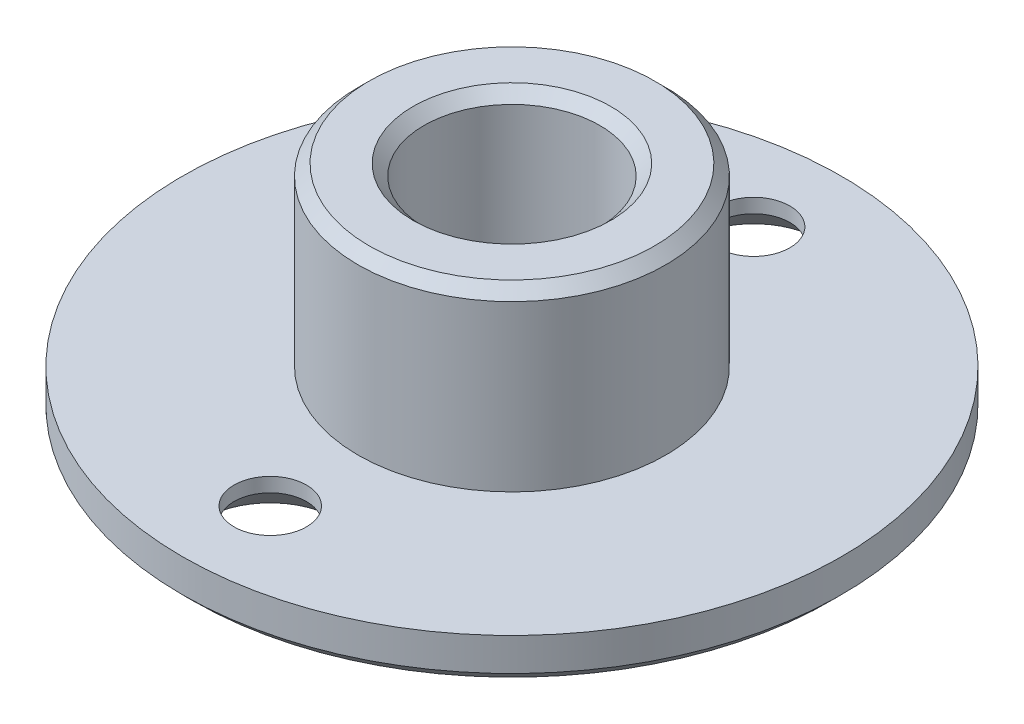
ISO-10303-21;
HEADER;
FILE_DESCRIPTION(('STEP AP214'),'2;1');
FILE_NAME('part.step','',(''),(''),'','','');
FILE_SCHEMA(('AUTOMOTIVE_DESIGN { 1 0 10303 214 1 1 1 1 }'));
ENDSEC;
DATA;
#1=APPLICATION_CONTEXT('core data for automotive mechanical design processes');
#2=APPLICATION_PROTOCOL_DEFINITION('international standard','automotive_design',2000,#1);
#3=PRODUCT_CONTEXT('',#1,'mechanical');
#4=PRODUCT('Part','Part','',(#3));
#5=PRODUCT_RELATED_PRODUCT_CATEGORY('part','',(#4));
#6=PRODUCT_DEFINITION_FORMATION('','',#4);
#7=PRODUCT_DEFINITION_CONTEXT('part definition',#1,'design');
#8=PRODUCT_DEFINITION('design','',#6,#7);
#9=PRODUCT_DEFINITION_SHAPE('','',#8);
#10=(LENGTH_UNIT() NAMED_UNIT(*) SI_UNIT(.MILLI.,.METRE.));
#11=(NAMED_UNIT(*) PLANE_ANGLE_UNIT() SI_UNIT($,.RADIAN.));
#12=(NAMED_UNIT(*) SI_UNIT($,.STERADIAN.) SOLID_ANGLE_UNIT());
#13=UNCERTAINTY_MEASURE_WITH_UNIT(LENGTH_MEASURE(1.E-05),#10,'distance_accuracy_value','');
#14=(GEOMETRIC_REPRESENTATION_CONTEXT(3) GLOBAL_UNCERTAINTY_ASSIGNED_CONTEXT((#13)) GLOBAL_UNIT_ASSIGNED_CONTEXT((#10,
#11,#12)) REPRESENTATION_CONTEXT('',''));
#15=CARTESIAN_POINT('',(0.,0.,0.));
#16=DIRECTION('',(0.,0.,1.));
#17=DIRECTION('',(1.,0.,0.));
#18=AXIS2_PLACEMENT_3D('',#15,#16,#17);
#19=CARTESIAN_POINT('',(0.,2.,0.));
#20=DIRECTION('',(0.,-1.,0.));
#21=DIRECTION('',(0.,0.,-1.));
#22=AXIS2_PLACEMENT_3D('',#19,#20,#21);
#23=CYLINDRICAL_SURFACE('',#22,15.);
#24=CARTESIAN_POINT('',(0.,0.499999999999999,0.));
#25=DIRECTION('',(0.,1.,0.));
#26=DIRECTION('',(0.,0.,1.));
#27=AXIS2_PLACEMENT_3D('',#24,#25,#26);
#28=CIRCLE('',#27,15.);
#29=CARTESIAN_POINT('',(0.,0.499999999999999,15.));
#30=VERTEX_POINT('',#29);
#31=EDGE_CURVE('E60',#30,#30,#28,.T.);
#32=ORIENTED_EDGE('',*,*,#31,.T.);
#33=EDGE_LOOP('',(#32));
#34=FACE_BOUND('',#33,.T.);
#35=CARTESIAN_POINT('',(0.,2.,0.));
#36=DIRECTION('',(0.,1.,0.));
#37=DIRECTION('',(0.,0.,1.));
#38=AXIS2_PLACEMENT_3D('',#35,#36,#37);
#39=CIRCLE('',#38,15.);
#40=CARTESIAN_POINT('',(0.,2.,15.));
#41=VERTEX_POINT('',#40);
#42=EDGE_CURVE('E85',#41,#41,#39,.T.);
#43=ORIENTED_EDGE('',*,*,#42,.F.);
#44=EDGE_LOOP('',(#43));
#45=FACE_BOUND('',#44,.T.);
#46=ADVANCED_FACE('F41',(#34,#45),#23,.T.);
#47=CARTESIAN_POINT('',(0.,2.,0.));
#48=DIRECTION('',(0.,1.,0.));
#49=DIRECTION('',(0.,0.,1.));
#50=AXIS2_PLACEMENT_3D('',#47,#48,#49);
#51=PLANE('',#50);
#52=CARTESIAN_POINT('',(0.,2.,11.));
#53=DIRECTION('',(0.,1.,0.));
#54=DIRECTION('',(0.,0.,1.));
#55=AXIS2_PLACEMENT_3D('',#52,#53,#54);
#56=CIRCLE('',#55,1.65);
#57=CARTESIAN_POINT('',(0.,2.,12.65));
#58=VERTEX_POINT('',#57);
#59=EDGE_CURVE('E73',#58,#58,#56,.T.);
#60=ORIENTED_EDGE('',*,*,#59,.F.);
#61=EDGE_LOOP('',(#60));
#62=FACE_BOUND('',#61,.T.);
#63=CARTESIAN_POINT('',(0.,2.,-11.));
#64=DIRECTION('',(0.,1.,0.));
#65=DIRECTION('',(0.,0.,1.));
#66=AXIS2_PLACEMENT_3D('',#63,#64,#65);
#67=CIRCLE('',#66,1.65);
#68=CARTESIAN_POINT('',(0.,2.,-9.35));
#69=VERTEX_POINT('',#68);
#70=EDGE_CURVE('E79',#69,#69,#67,.T.);
#71=ORIENTED_EDGE('',*,*,#70,.F.);
#72=EDGE_LOOP('',(#71));
#73=FACE_BOUND('',#72,.T.);
#74=CARTESIAN_POINT('',(0.,2.,0.));
#75=DIRECTION('',(0.,1.,0.));
#76=DIRECTION('',(0.,0.,1.));
#77=AXIS2_PLACEMENT_3D('',#74,#75,#76);
#78=CIRCLE('',#77,7.);
#79=CARTESIAN_POINT('',(0.,2.,7.));
#80=VERTEX_POINT('',#79);
#81=EDGE_CURVE('E74',#80,#80,#78,.T.);
#82=ORIENTED_EDGE('',*,*,#81,.F.);
#83=EDGE_LOOP('',(#82));
#84=FACE_BOUND('',#83,.T.);
#85=ORIENTED_EDGE('',*,*,#42,.T.);
#86=EDGE_LOOP('',(#85));
#87=FACE_BOUND('',#86,.T.);
#88=ADVANCED_FACE('F104',(#62,#73,#84,#87),#51,.T.);
#89=CARTESIAN_POINT('',(0.,0.,0.));
#90=DIRECTION('',(0.,1.,0.));
#91=DIRECTION('',(0.,0.,1.));
#92=AXIS2_PLACEMENT_3D('',#89,#90,#91);
#93=PLANE('',#92);
#94=CARTESIAN_POINT('',(0.,0.,0.));
#95=DIRECTION('',(0.,1.,0.));
#96=DIRECTION('',(0.,0.,1.));
#97=AXIS2_PLACEMENT_3D('',#94,#95,#96);
#98=CIRCLE('',#97,4.49999999999999);
#99=CARTESIAN_POINT('',(0.,0.,4.49999999999999));
#100=VERTEX_POINT('',#99);
#101=EDGE_CURVE('E70',#100,#100,#98,.T.);
#102=ORIENTED_EDGE('',*,*,#101,.T.);
#103=EDGE_LOOP('',(#102));
#104=FACE_BOUND('',#103,.T.);
#105=CARTESIAN_POINT('',(0.,0.,0.));
#106=DIRECTION('',(0.,1.,0.));
#107=DIRECTION('',(0.,0.,1.));
#108=AXIS2_PLACEMENT_3D('',#105,#106,#107);
#109=CIRCLE('',#108,14.5);
#110=CARTESIAN_POINT('',(0.,0.,14.5));
#111=VERTEX_POINT('',#110);
#112=EDGE_CURVE('E72',#111,#111,#109,.F.);
#113=ORIENTED_EDGE('',*,*,#112,.T.);
#114=EDGE_LOOP('',(#113));
#115=FACE_BOUND('',#114,.T.);
#116=CARTESIAN_POINT('',(0.,0.,11.));
#117=DIRECTION('',(0.,-1.,0.));
#118=DIRECTION('',(0.,0.,-1.));
#119=AXIS2_PLACEMENT_3D('',#116,#117,#118);
#120=CIRCLE('',#119,3.);
#121=CARTESIAN_POINT('',(0.,0.,8.));
#122=VERTEX_POINT('',#121);
#123=EDGE_CURVE('E92',#122,#122,#120,.T.);
#124=ORIENTED_EDGE('',*,*,#123,.F.);
#125=EDGE_LOOP('',(#124));
#126=FACE_BOUND('',#125,.T.);
#127=CARTESIAN_POINT('',(0.,0.,-11.));
#128=DIRECTION('',(0.,-1.,0.));
#129=DIRECTION('',(0.,0.,-1.));
#130=AXIS2_PLACEMENT_3D('',#127,#128,#129);
#131=CIRCLE('',#130,3.);
#132=CARTESIAN_POINT('',(0.,0.,-14.));
#133=VERTEX_POINT('',#132);
#134=EDGE_CURVE('E77',#133,#133,#131,.T.);
#135=ORIENTED_EDGE('',*,*,#134,.F.);
#136=EDGE_LOOP('',(#135));
#137=FACE_BOUND('',#136,.T.);
#138=ADVANCED_FACE('F101',(#104,#115,#126,#137),#93,.F.);
#139=CARTESIAN_POINT('',(0.,10.,0.));
#140=DIRECTION('',(0.,-1.,0.));
#141=DIRECTION('',(0.,0.,-1.));
#142=AXIS2_PLACEMENT_3D('',#139,#140,#141);
#143=CYLINDRICAL_SURFACE('',#142,7.);
#144=CARTESIAN_POINT('',(0.,9.50000000000001,0.));
#145=DIRECTION('',(0.,1.,0.));
#146=DIRECTION('',(0.,0.,1.));
#147=AXIS2_PLACEMENT_3D('',#144,#145,#146);
#148=CIRCLE('',#147,7.);
#149=CARTESIAN_POINT('',(0.,9.50000000000001,7.));
#150=VERTEX_POINT('',#149);
#151=EDGE_CURVE('E10',#150,#150,#148,.F.);
#152=ORIENTED_EDGE('',*,*,#151,.T.);
#153=EDGE_LOOP('',(#152));
#154=FACE_BOUND('',#153,.T.);
#155=ORIENTED_EDGE('',*,*,#81,.T.);
#156=EDGE_LOOP('',(#155));
#157=FACE_BOUND('',#156,.T.);
#158=ADVANCED_FACE('F102',(#154,#157),#143,.T.);
#159=CARTESIAN_POINT('',(0.,10.,0.));
#160=DIRECTION('',(0.,1.,0.));
#161=DIRECTION('',(0.,0.,1.));
#162=AXIS2_PLACEMENT_3D('',#159,#160,#161);
#163=PLANE('',#162);
#164=CARTESIAN_POINT('',(0.,10.,0.));
#165=DIRECTION('',(0.,1.,0.));
#166=DIRECTION('',(0.,0.,1.));
#167=AXIS2_PLACEMENT_3D('',#164,#165,#166);
#168=CIRCLE('',#167,4.49999999999999);
#169=CARTESIAN_POINT('',(0.,10.,4.49999999999999));
#170=VERTEX_POINT('',#169);
#171=EDGE_CURVE('E47',#170,#170,#168,.F.);
#172=ORIENTED_EDGE('',*,*,#171,.T.);
#173=EDGE_LOOP('',(#172));
#174=FACE_BOUND('',#173,.T.);
#175=CARTESIAN_POINT('',(0.,10.,0.));
#176=DIRECTION('',(0.,1.,0.));
#177=DIRECTION('',(0.,0.,1.));
#178=AXIS2_PLACEMENT_3D('',#175,#176,#177);
#179=CIRCLE('',#178,6.50000000000001);
#180=CARTESIAN_POINT('',(0.,10.,6.50000000000001));
#181=VERTEX_POINT('',#180);
#182=EDGE_CURVE('E52',#181,#181,#179,.T.);
#183=ORIENTED_EDGE('',*,*,#182,.T.);
#184=EDGE_LOOP('',(#183));
#185=FACE_BOUND('',#184,.T.);
#186=ADVANCED_FACE('F163',(#174,#185),#163,.T.);
#187=CARTESIAN_POINT('',(0.,10.,0.));
#188=DIRECTION('',(0.,1.,0.));
#189=DIRECTION('',(0.,0.,1.));
#190=AXIS2_PLACEMENT_3D('',#187,#188,#189);
#191=CYLINDRICAL_SURFACE('',#190,3.99999999999999);
#192=CARTESIAN_POINT('',(0.,0.500000000000007,0.));
#193=DIRECTION('',(0.,1.,0.));
#194=DIRECTION('',(0.,0.,1.));
#195=AXIS2_PLACEMENT_3D('',#192,#193,#194);
#196=CIRCLE('',#195,3.99999999999999);
#197=CARTESIAN_POINT('',(0.,0.500000000000007,3.99999999999999));
#198=VERTEX_POINT('',#197);
#199=EDGE_CURVE('E65',#198,#198,#196,.F.);
#200=ORIENTED_EDGE('',*,*,#199,.T.);
#201=EDGE_LOOP('',(#200));
#202=FACE_BOUND('',#201,.T.);
#203=CARTESIAN_POINT('',(0.,9.5,0.));
#204=DIRECTION('',(0.,1.,0.));
#205=DIRECTION('',(0.,0.,1.));
#206=AXIS2_PLACEMENT_3D('',#203,#204,#205);
#207=CIRCLE('',#206,3.99999999999999);
#208=CARTESIAN_POINT('',(0.,9.5,3.99999999999999));
#209=VERTEX_POINT('',#208);
#210=EDGE_CURVE('E64',#209,#209,#207,.T.);
#211=ORIENTED_EDGE('',*,*,#210,.T.);
#212=EDGE_LOOP('',(#211));
#213=FACE_BOUND('',#212,.T.);
#214=ADVANCED_FACE('F125',(#202,#213),#191,.F.);
#215=CARTESIAN_POINT('',(0.,0.,-11.));
#216=DIRECTION('',(0.,-1.,0.));
#217=DIRECTION('',(0.,0.,-1.));
#218=AXIS2_PLACEMENT_3D('',#215,#216,#217);
#219=CYLINDRICAL_SURFACE('',#218,1.65);
#220=ORIENTED_EDGE('',*,*,#70,.T.);
#221=EDGE_LOOP('',(#220));
#222=FACE_BOUND('',#221,.T.);
#223=CARTESIAN_POINT('',(0.,1.35,-11.));
#224=DIRECTION('',(0.,-1.,0.));
#225=DIRECTION('',(0.,0.,-1.));
#226=AXIS2_PLACEMENT_3D('',#223,#224,#225);
#227=CIRCLE('',#226,1.65);
#228=CARTESIAN_POINT('',(0.,1.35,-12.65));
#229=VERTEX_POINT('',#228);
#230=EDGE_CURVE('E83',#229,#229,#227,.T.);
#231=ORIENTED_EDGE('',*,*,#230,.T.);
#232=EDGE_LOOP('',(#231));
#233=FACE_BOUND('',#232,.T.);
#234=ADVANCED_FACE('F114',(#222,#233),#219,.F.);
#235=CARTESIAN_POINT('',(0.,0.,-11.));
#236=DIRECTION('',(0.,-1.,0.));
#237=DIRECTION('',(0.,0.,-1.));
#238=AXIS2_PLACEMENT_3D('',#235,#236,#237);
#239=CONICAL_SURFACE('',#238,3.,0.785398163397448);
#240=ORIENTED_EDGE('',*,*,#230,.F.);
#241=EDGE_LOOP('',(#240));
#242=FACE_BOUND('',#241,.T.);
#243=ORIENTED_EDGE('',*,*,#134,.T.);
#244=EDGE_LOOP('',(#243));
#245=FACE_BOUND('',#244,.T.);
#246=ADVANCED_FACE('F109',(#242,#245),#239,.F.);
#247=CARTESIAN_POINT('',(0.,0.,11.));
#248=DIRECTION('',(0.,-1.,0.));
#249=DIRECTION('',(0.,0.,-1.));
#250=AXIS2_PLACEMENT_3D('',#247,#248,#249);
#251=CYLINDRICAL_SURFACE('',#250,1.65);
#252=ORIENTED_EDGE('',*,*,#59,.T.);
#253=EDGE_LOOP('',(#252));
#254=FACE_BOUND('',#253,.T.);
#255=CARTESIAN_POINT('',(0.,1.35,11.));
#256=DIRECTION('',(0.,-1.,0.));
#257=DIRECTION('',(0.,0.,-1.));
#258=AXIS2_PLACEMENT_3D('',#255,#256,#257);
#259=CIRCLE('',#258,1.65);
#260=CARTESIAN_POINT('',(0.,1.35,9.35));
#261=VERTEX_POINT('',#260);
#262=EDGE_CURVE('E78',#261,#261,#259,.T.);
#263=ORIENTED_EDGE('',*,*,#262,.T.);
#264=EDGE_LOOP('',(#263));
#265=FACE_BOUND('',#264,.T.);
#266=ADVANCED_FACE('F115',(#254,#265),#251,.F.);
#267=CARTESIAN_POINT('',(0.,0.,11.));
#268=DIRECTION('',(0.,-1.,0.));
#269=DIRECTION('',(0.,0.,-1.));
#270=AXIS2_PLACEMENT_3D('',#267,#268,#269);
#271=CONICAL_SURFACE('',#270,3.,0.785398163397448);
#272=ORIENTED_EDGE('',*,*,#262,.F.);
#273=EDGE_LOOP('',(#272));
#274=FACE_BOUND('',#273,.T.);
#275=ORIENTED_EDGE('',*,*,#123,.T.);
#276=EDGE_LOOP('',(#275));
#277=FACE_BOUND('',#276,.T.);
#278=ADVANCED_FACE('F97',(#274,#277),#271,.F.);
#279=CARTESIAN_POINT('',(0.,0.,0.));
#280=DIRECTION('',(0.,-1.,0.));
#281=DIRECTION('',(0.,0.,-1.));
#282=AXIS2_PLACEMENT_3D('',#279,#280,#281);
#283=CONICAL_SURFACE('',#282,4.49999999999999,0.785398163397441);
#284=ORIENTED_EDGE('',*,*,#199,.F.);
#285=EDGE_LOOP('',(#284));
#286=FACE_BOUND('',#285,.T.);
#287=ORIENTED_EDGE('',*,*,#101,.F.);
#288=EDGE_LOOP('',(#287));
#289=FACE_BOUND('',#288,.T.);
#290=ADVANCED_FACE('F140',(#286,#289),#283,.F.);
#291=CARTESIAN_POINT('',(0.,0.499999999999999,0.));
#292=DIRECTION('',(0.,1.,0.));
#293=DIRECTION('',(0.,0.,1.));
#294=AXIS2_PLACEMENT_3D('',#291,#292,#293);
#295=CONICAL_SURFACE('',#294,15.,0.785398163397448);
#296=ORIENTED_EDGE('',*,*,#112,.F.);
#297=EDGE_LOOP('',(#296));
#298=FACE_BOUND('',#297,.T.);
#299=ORIENTED_EDGE('',*,*,#31,.F.);
#300=EDGE_LOOP('',(#299));
#301=FACE_BOUND('',#300,.T.);
#302=ADVANCED_FACE('F145',(#298,#301),#295,.T.);
#303=CARTESIAN_POINT('',(0.,9.5,0.));
#304=DIRECTION('',(0.,1.,0.));
#305=DIRECTION('',(0.,0.,1.));
#306=AXIS2_PLACEMENT_3D('',#303,#304,#305);
#307=CONICAL_SURFACE('',#306,3.99999999999999,0.785398163397445);
#308=ORIENTED_EDGE('',*,*,#171,.F.);
#309=EDGE_LOOP('',(#308));
#310=FACE_BOUND('',#309,.T.);
#311=ORIENTED_EDGE('',*,*,#210,.F.);
#312=EDGE_LOOP('',(#311));
#313=FACE_BOUND('',#312,.T.);
#314=ADVANCED_FACE('F147',(#310,#313),#307,.F.);
#315=CARTESIAN_POINT('',(0.,10.,0.));
#316=DIRECTION('',(0.,-1.,0.));
#317=DIRECTION('',(0.,0.,-1.));
#318=AXIS2_PLACEMENT_3D('',#315,#316,#317);
#319=CONICAL_SURFACE('',#318,6.50000000000001,0.785398163397451);
#320=ORIENTED_EDGE('',*,*,#151,.F.);
#321=EDGE_LOOP('',(#320));
#322=FACE_BOUND('',#321,.T.);
#323=ORIENTED_EDGE('',*,*,#182,.F.);
#324=EDGE_LOOP('',(#323));
#325=FACE_BOUND('',#324,.T.);
#326=ADVANCED_FACE('F42',(#322,#325),#319,.T.);
#327=CLOSED_SHELL('',(#46,#88,#138,#158,#186,#214,#234,#246,#266,#278,#290,#302,#314,#326));
#328=MANIFOLD_SOLID_BREP('B2',#327);
#329=ADVANCED_BREP_SHAPE_REPRESENTATION('',(#18,#328),#14);
#330=SHAPE_DEFINITION_REPRESENTATION(#9,#329);
ENDSEC;
END-ISO-10303-21;
